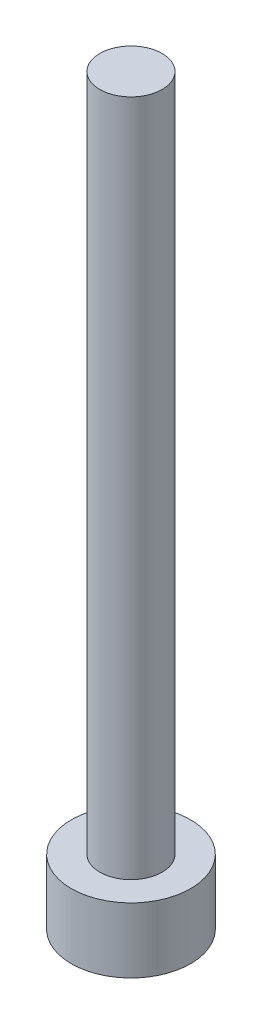
ISO-10303-21;
HEADER;
FILE_DESCRIPTION(('STEP AP214'),'2;1');
FILE_NAME('part.step','',(''),(''),'','','');
FILE_SCHEMA(('AUTOMOTIVE_DESIGN { 1 0 10303 214 1 1 1 1 }'));
ENDSEC;
DATA;
#1=APPLICATION_CONTEXT('core data for automotive mechanical design processes');
#2=APPLICATION_PROTOCOL_DEFINITION('international standard','automotive_design',2000,#1);
#3=PRODUCT_CONTEXT('',#1,'mechanical');
#4=PRODUCT('Part','Part','',(#3));
#5=PRODUCT_RELATED_PRODUCT_CATEGORY('part','',(#4));
#6=PRODUCT_DEFINITION_FORMATION('','',#4);
#7=PRODUCT_DEFINITION_CONTEXT('part definition',#1,'design');
#8=PRODUCT_DEFINITION('design','',#6,#7);
#9=PRODUCT_DEFINITION_SHAPE('','',#8);
#10=(LENGTH_UNIT() NAMED_UNIT(*) SI_UNIT(.MILLI.,.METRE.));
#11=(NAMED_UNIT(*) PLANE_ANGLE_UNIT() SI_UNIT($,.RADIAN.));
#12=(NAMED_UNIT(*) SI_UNIT($,.STERADIAN.) SOLID_ANGLE_UNIT());
#13=UNCERTAINTY_MEASURE_WITH_UNIT(LENGTH_MEASURE(1.E-05),#10,'distance_accuracy_value','');
#14=(GEOMETRIC_REPRESENTATION_CONTEXT(3) GLOBAL_UNCERTAINTY_ASSIGNED_CONTEXT((#13)) GLOBAL_UNIT_ASSIGNED_CONTEXT((#10,
#11,#12)) REPRESENTATION_CONTEXT('',''));
#15=CARTESIAN_POINT('',(0.,0.,0.));
#16=DIRECTION('',(0.,0.,1.));
#17=DIRECTION('',(1.,0.,0.));
#18=AXIS2_PLACEMENT_3D('',#15,#16,#17);
#19=CARTESIAN_POINT('',(0.,2.4,0.));
#20=DIRECTION('',(0.,-1.,0.));
#21=DIRECTION('',(0.,0.,-1.));
#22=AXIS2_PLACEMENT_3D('',#19,#20,#21);
#23=CYLINDRICAL_SURFACE('',#22,2.2);
#24=CARTESIAN_POINT('',(0.,2.4,0.));
#25=DIRECTION('',(0.,1.,0.));
#26=DIRECTION('',(0.,0.,1.));
#27=AXIS2_PLACEMENT_3D('',#24,#25,#26);
#28=CIRCLE('',#27,2.2);
#29=CARTESIAN_POINT('',(0.,2.4,2.2));
#30=VERTEX_POINT('',#29);
#31=EDGE_CURVE('E47',#30,#30,#28,.T.);
#32=ORIENTED_EDGE('',*,*,#31,.F.);
#33=EDGE_LOOP('',(#32));
#34=FACE_BOUND('',#33,.T.);
#35=CARTESIAN_POINT('',(0.,0.,0.));
#36=DIRECTION('',(0.,1.,0.));
#37=DIRECTION('',(0.,0.,1.));
#38=AXIS2_PLACEMENT_3D('',#35,#36,#37);
#39=CIRCLE('',#38,2.2);
#40=CARTESIAN_POINT('',(0.,0.,2.2));
#41=VERTEX_POINT('',#40);
#42=EDGE_CURVE('E42',#41,#41,#39,.T.);
#43=ORIENTED_EDGE('',*,*,#42,.T.);
#44=EDGE_LOOP('',(#43));
#45=FACE_BOUND('',#44,.T.);
#46=ADVANCED_FACE('F39',(#34,#45),#23,.T.);
#47=CARTESIAN_POINT('',(0.,2.4,0.));
#48=DIRECTION('',(0.,1.,0.));
#49=DIRECTION('',(0.,0.,1.));
#50=AXIS2_PLACEMENT_3D('',#47,#48,#49);
#51=PLANE('',#50);
#52=CARTESIAN_POINT('',(0.,2.4,0.));
#53=DIRECTION('',(0.,1.,0.));
#54=DIRECTION('',(0.,0.,1.));
#55=AXIS2_PLACEMENT_3D('',#52,#53,#54);
#56=CIRCLE('',#55,1.15);
#57=CARTESIAN_POINT('',(0.,2.4,1.15));
#58=VERTEX_POINT('',#57);
#59=EDGE_CURVE('E11',#58,#58,#56,.T.);
#60=ORIENTED_EDGE('',*,*,#59,.F.);
#61=EDGE_LOOP('',(#60));
#62=FACE_BOUND('',#61,.T.);
#63=ORIENTED_EDGE('',*,*,#31,.T.);
#64=EDGE_LOOP('',(#63));
#65=FACE_BOUND('',#64,.T.);
#66=ADVANCED_FACE('F216',(#62,#65),#51,.T.);
#67=CARTESIAN_POINT('',(0.,0.,0.));
#68=DIRECTION('',(0.,1.,0.));
#69=DIRECTION('',(0.,0.,1.));
#70=AXIS2_PLACEMENT_3D('',#67,#68,#69);
#71=PLANE('',#70);
#72=DIRECTION('',(1.,0.,0.));
#73=VECTOR('',#72,1.);
#74=CARTESIAN_POINT('',(0.,0.,0.999999999999996));
#75=LINE('',#74,#73);
#76=CARTESIAN_POINT('',(-0.567890834580024,0.,1.));
#77=VERTEX_POINT('',#76);
#78=CARTESIAN_POINT('',(0.567890834580045,0.,0.99999999999999));
#79=VERTEX_POINT('',#78);
#80=EDGE_CURVE('E55',#77,#79,#75,.T.);
#81=ORIENTED_EDGE('',*,*,#80,.T.);
#82=CARTESIAN_POINT('',(0.,0.,0.));
#83=DIRECTION('',(0.,1.,0.));
#84=DIRECTION('',(0.,0.,1.));
#85=AXIS2_PLACEMENT_3D('',#82,#83,#84);
#86=CIRCLE('',#85,1.15);
#87=CARTESIAN_POINT('',(0.58207998649443,0.,0.991807889322647));
#88=VERTEX_POINT('',#87);
#89=EDGE_CURVE('E164',#79,#88,#86,.T.);
#90=ORIENTED_EDGE('',*,*,#89,.T.);
#91=DIRECTION('',(0.499999999999995,0.,-0.866025403784442));
#92=VECTOR('',#91,1.);
#93=CARTESIAN_POINT('',(0.866025403784441,0.,0.499999999999995));
#94=LINE('',#93,#92);
#95=CARTESIAN_POINT('',(1.14997082107445,0.,0.0081921106773428));
#96=VERTEX_POINT('',#95);
#97=EDGE_CURVE('E167',#88,#96,#94,.T.);
#98=ORIENTED_EDGE('',*,*,#97,.T.);
#99=CARTESIAN_POINT('',(1.14997082107445,0.,-0.00819211067734334));
#100=VERTEX_POINT('',#99);
#101=EDGE_CURVE('E169',#96,#100,#86,.T.);
#102=ORIENTED_EDGE('',*,*,#101,.T.);
#103=DIRECTION('',(-0.500000000000001,0.,-0.866025403784438));
#104=VECTOR('',#103,1.);
#105=CARTESIAN_POINT('',(0.866025403784435,0.,-0.499999999999999));
#106=LINE('',#105,#104);
#107=CARTESIAN_POINT('',(0.582079986494417,0.,-0.991807889322655));
#108=VERTEX_POINT('',#107);
#109=EDGE_CURVE('E172',#100,#108,#106,.T.);
#110=ORIENTED_EDGE('',*,*,#109,.T.);
#111=CARTESIAN_POINT('',(0.567890834580031,0.,-0.999999999999998));
#112=VERTEX_POINT('',#111);
#113=EDGE_CURVE('E175',#108,#112,#86,.T.);
#114=ORIENTED_EDGE('',*,*,#113,.T.);
#115=DIRECTION('',(-1.,0.,0.));
#116=VECTOR('',#115,1.);
#117=CARTESIAN_POINT('',(0.,0.,-0.999999999999996));
#118=LINE('',#117,#116);
#119=CARTESIAN_POINT('',(-0.567890834580038,0.,-0.999999999999994));
#120=VERTEX_POINT('',#119);
#121=EDGE_CURVE('E176',#112,#120,#118,.T.);
#122=ORIENTED_EDGE('',*,*,#121,.T.);
#123=CARTESIAN_POINT('',(-0.582079986494424,0.,-0.991807889322651));
#124=VERTEX_POINT('',#123);
#125=EDGE_CURVE('E179',#120,#124,#86,.T.);
#126=ORIENTED_EDGE('',*,*,#125,.T.);
#127=DIRECTION('',(-0.499999999999995,0.,0.866025403784442));
#128=VECTOR('',#127,1.);
#129=CARTESIAN_POINT('',(-0.866025403784438,0.,-0.499999999999993));
#130=LINE('',#129,#128);
#131=CARTESIAN_POINT('',(-1.14997082107445,0.,-0.00819211067733553));
#132=VERTEX_POINT('',#131);
#133=EDGE_CURVE('E180',#124,#132,#130,.T.);
#134=ORIENTED_EDGE('',*,*,#133,.T.);
#135=CARTESIAN_POINT('',(-1.14997082107445,0.,0.00819211067735191));
#136=VERTEX_POINT('',#135);
#137=EDGE_CURVE('E183',#132,#136,#86,.T.);
#138=ORIENTED_EDGE('',*,*,#137,.T.);
#139=DIRECTION('',(0.500000000000007,0.,0.866025403784435));
#140=VECTOR('',#139,1.);
#141=CARTESIAN_POINT('',(-0.866025403784431,0.,0.500000000000005));
#142=LINE('',#141,#140);
#143=CARTESIAN_POINT('',(-0.582079986494411,0.,0.991807889322659));
#144=VERTEX_POINT('',#143);
#145=EDGE_CURVE('E154',#136,#144,#142,.T.);
#146=ORIENTED_EDGE('',*,*,#145,.T.);
#147=EDGE_CURVE('E168',#144,#77,#86,.T.);
#148=ORIENTED_EDGE('',*,*,#147,.T.);
#149=EDGE_LOOP('',(#81,#90,#98,#102,#110,#114,#122,#126,#134,#138,#146,#148));
#150=FACE_BOUND('',#149,.T.);
#151=ORIENTED_EDGE('',*,*,#42,.F.);
#152=EDGE_LOOP('',(#151));
#153=FACE_BOUND('',#152,.T.);
#154=ADVANCED_FACE('F213',(#150,#153),#71,.F.);
#155=CARTESIAN_POINT('',(0.,27.4,0.));
#156=DIRECTION('',(0.,-1.,0.));
#157=DIRECTION('',(0.,0.,-1.));
#158=AXIS2_PLACEMENT_3D('',#155,#156,#157);
#159=CYLINDRICAL_SURFACE('',#158,1.15);
#160=CARTESIAN_POINT('',(0.,27.4,0.));
#161=DIRECTION('',(0.,1.,0.));
#162=DIRECTION('',(0.,0.,1.));
#163=AXIS2_PLACEMENT_3D('',#160,#161,#162);
#164=CIRCLE('',#163,1.15);
#165=CARTESIAN_POINT('',(0.,27.4,1.15));
#166=VERTEX_POINT('',#165);
#167=EDGE_CURVE('E204',#166,#166,#164,.T.);
#168=ORIENTED_EDGE('',*,*,#167,.F.);
#169=EDGE_LOOP('',(#168));
#170=FACE_BOUND('',#169,.T.);
#171=ORIENTED_EDGE('',*,*,#59,.T.);
#172=EDGE_LOOP('',(#171));
#173=FACE_BOUND('',#172,.T.);
#174=ADVANCED_FACE('F215',(#170,#173),#159,.T.);
#175=CARTESIAN_POINT('',(0.,27.4,0.));
#176=DIRECTION('',(0.,1.,0.));
#177=DIRECTION('',(0.,0.,1.));
#178=AXIS2_PLACEMENT_3D('',#175,#176,#177);
#179=PLANE('',#178);
#180=ORIENTED_EDGE('',*,*,#167,.T.);
#181=EDGE_LOOP('',(#180));
#182=FACE_BOUND('',#181,.T.);
#183=ADVANCED_FACE('F222',(#182),#179,.T.);
#184=CARTESIAN_POINT('',(0.,1.5,0.999999999999996));
#185=DIRECTION('',(0.,0.,-1.));
#186=DIRECTION('',(-1.,0.,0.));
#187=AXIS2_PLACEMENT_3D('',#184,#185,#186);
#188=PLANE('',#187);
#189=ORIENTED_EDGE('',*,*,#80,.F.);
#190=DIRECTION('',(0.,-1.,0.));
#191=VECTOR('',#190,1.);
#192=CARTESIAN_POINT('',(-0.567890834580024,1.5,1.));
#193=LINE('',#192,#191);
#194=CARTESIAN_POINT('',(-0.567890834580024,1.5,1.));
#195=VERTEX_POINT('',#194);
#196=EDGE_CURVE('E159',#195,#77,#193,.T.);
#197=ORIENTED_EDGE('',*,*,#196,.F.);
#198=DIRECTION('',(1.,0.,0.));
#199=VECTOR('',#198,1.);
#200=CARTESIAN_POINT('',(0.,1.5,0.999999999999996));
#201=LINE('',#200,#199);
#202=CARTESIAN_POINT('',(0.567890834580045,1.5,0.99999999999999));
#203=VERTEX_POINT('',#202);
#204=EDGE_CURVE('E406',#195,#203,#201,.T.);
#205=ORIENTED_EDGE('',*,*,#204,.T.);
#206=DIRECTION('',(0.,-1.,0.));
#207=VECTOR('',#206,1.);
#208=CARTESIAN_POINT('',(0.567890834580045,1.5,0.99999999999999));
#209=LINE('',#208,#207);
#210=EDGE_CURVE('E202',#203,#79,#209,.T.);
#211=ORIENTED_EDGE('',*,*,#210,.T.);
#212=EDGE_LOOP('',(#189,#197,#205,#211));
#213=FACE_BOUND('',#212,.T.);
#214=ADVANCED_FACE('F251',(#213),#188,.T.);
#215=CARTESIAN_POINT('',(0.,1.5,0.));
#216=DIRECTION('',(0.,-1.,0.));
#217=DIRECTION('',(0.,0.,-1.));
#218=AXIS2_PLACEMENT_3D('',#215,#216,#217);
#219=CYLINDRICAL_SURFACE('',#218,1.15);
#220=ORIENTED_EDGE('',*,*,#89,.F.);
#221=ORIENTED_EDGE('',*,*,#210,.F.);
#222=CARTESIAN_POINT('',(0.,1.5,0.));
#223=DIRECTION('',(0.,1.,0.));
#224=DIRECTION('',(0.,0.,1.));
#225=AXIS2_PLACEMENT_3D('',#222,#223,#224);
#226=CIRCLE('',#225,1.15);
#227=CARTESIAN_POINT('',(0.58207998649443,1.5,0.991807889322647));
#228=VERTEX_POINT('',#227);
#229=EDGE_CURVE('E112',#203,#228,#226,.T.);
#230=ORIENTED_EDGE('',*,*,#229,.T.);
#231=DIRECTION('',(0.,-1.,0.));
#232=VECTOR('',#231,1.);
#233=CARTESIAN_POINT('',(0.58207998649443,1.5,0.991807889322647));
#234=LINE('',#233,#232);
#235=EDGE_CURVE('E200',#228,#88,#234,.T.);
#236=ORIENTED_EDGE('',*,*,#235,.T.);
#237=EDGE_LOOP('',(#220,#221,#230,#236));
#238=FACE_BOUND('',#237,.T.);
#239=ADVANCED_FACE('F266',(#238),#219,.F.);
#240=CARTESIAN_POINT('',(0.866025403784441,1.5,0.499999999999995));
#241=DIRECTION('',(-0.866025403784441,0.,-0.499999999999995));
#242=DIRECTION('',(-0.499999999999995,0.,0.866025403784442));
#243=AXIS2_PLACEMENT_3D('',#240,#241,#242);
#244=PLANE('',#243);
#245=ORIENTED_EDGE('',*,*,#97,.F.);
#246=ORIENTED_EDGE('',*,*,#235,.F.);
#247=DIRECTION('',(0.499999999999995,0.,-0.866025403784442));
#248=VECTOR('',#247,1.);
#249=CARTESIAN_POINT('',(0.866025403784441,1.5,0.499999999999995));
#250=LINE('',#249,#248);
#251=CARTESIAN_POINT('',(1.14997082107445,1.5,0.0081921106773428));
#252=VERTEX_POINT('',#251);
#253=EDGE_CURVE('E435',#228,#252,#250,.T.);
#254=ORIENTED_EDGE('',*,*,#253,.T.);
#255=DIRECTION('',(0.,-1.,0.));
#256=VECTOR('',#255,1.);
#257=CARTESIAN_POINT('',(1.14997082107445,1.5,0.0081921106773428));
#258=LINE('',#257,#256);
#259=EDGE_CURVE('E198',#252,#96,#258,.T.);
#260=ORIENTED_EDGE('',*,*,#259,.T.);
#261=EDGE_LOOP('',(#245,#246,#254,#260));
#262=FACE_BOUND('',#261,.T.);
#263=ADVANCED_FACE('F276',(#262),#244,.T.);
#264=ORIENTED_EDGE('',*,*,#101,.F.);
#265=ORIENTED_EDGE('',*,*,#259,.F.);
#266=CARTESIAN_POINT('',(1.14997082107445,1.5,-0.00819211067734334));
#267=VERTEX_POINT('',#266);
#268=EDGE_CURVE('E419',#252,#267,#226,.T.);
#269=ORIENTED_EDGE('',*,*,#268,.T.);
#270=DIRECTION('',(0.,-1.,0.));
#271=VECTOR('',#270,1.);
#272=CARTESIAN_POINT('',(1.14997082107445,1.5,-0.00819211067734334));
#273=LINE('',#272,#271);
#274=EDGE_CURVE('E196',#267,#100,#273,.T.);
#275=ORIENTED_EDGE('',*,*,#274,.T.);
#276=EDGE_LOOP('',(#264,#265,#269,#275));
#277=FACE_BOUND('',#276,.T.);
#278=ADVANCED_FACE('F279',(#277),#219,.F.);
#279=CARTESIAN_POINT('',(0.866025403784435,1.5,-0.499999999999999));
#280=DIRECTION('',(-0.866025403784438,0.,0.500000000000001));
#281=DIRECTION('',(0.500000000000001,0.,0.866025403784438));
#282=AXIS2_PLACEMENT_3D('',#279,#280,#281);
#283=PLANE('',#282);
#284=ORIENTED_EDGE('',*,*,#109,.F.);
#285=ORIENTED_EDGE('',*,*,#274,.F.);
#286=DIRECTION('',(-0.500000000000001,0.,-0.866025403784438));
#287=VECTOR('',#286,1.);
#288=CARTESIAN_POINT('',(0.866025403784435,1.5,-0.499999999999999));
#289=LINE('',#288,#287);
#290=CARTESIAN_POINT('',(0.582079986494417,1.5,-0.991807889322655));
#291=VERTEX_POINT('',#290);
#292=EDGE_CURVE('E422',#267,#291,#289,.T.);
#293=ORIENTED_EDGE('',*,*,#292,.T.);
#294=DIRECTION('',(0.,-1.,0.));
#295=VECTOR('',#294,1.);
#296=CARTESIAN_POINT('',(0.582079986494417,1.5,-0.991807889322655));
#297=LINE('',#296,#295);
#298=EDGE_CURVE('E194',#291,#108,#297,.T.);
#299=ORIENTED_EDGE('',*,*,#298,.T.);
#300=EDGE_LOOP('',(#284,#285,#293,#299));
#301=FACE_BOUND('',#300,.T.);
#302=ADVANCED_FACE('F299',(#301),#283,.T.);
#303=ORIENTED_EDGE('',*,*,#113,.F.);
#304=ORIENTED_EDGE('',*,*,#298,.F.);
#305=CARTESIAN_POINT('',(0.567890834580031,1.5,-0.999999999999998));
#306=VERTEX_POINT('',#305);
#307=EDGE_CURVE('E426',#291,#306,#226,.T.);
#308=ORIENTED_EDGE('',*,*,#307,.T.);
#309=DIRECTION('',(0.,-1.,0.));
#310=VECTOR('',#309,1.);
#311=CARTESIAN_POINT('',(0.567890834580031,1.5,-0.999999999999998));
#312=LINE('',#311,#310);
#313=EDGE_CURVE('E192',#306,#112,#312,.T.);
#314=ORIENTED_EDGE('',*,*,#313,.T.);
#315=EDGE_LOOP('',(#303,#304,#308,#314));
#316=FACE_BOUND('',#315,.T.);
#317=ADVANCED_FACE('F301',(#316),#219,.F.);
#318=CARTESIAN_POINT('',(0.,1.5,-0.999999999999996));
#319=DIRECTION('',(0.,0.,1.));
#320=DIRECTION('',(1.,0.,0.));
#321=AXIS2_PLACEMENT_3D('',#318,#319,#320);
#322=PLANE('',#321);
#323=ORIENTED_EDGE('',*,*,#121,.F.);
#324=ORIENTED_EDGE('',*,*,#313,.F.);
#325=DIRECTION('',(-1.,0.,0.));
#326=VECTOR('',#325,1.);
#327=CARTESIAN_POINT('',(0.,1.5,-0.999999999999996));
#328=LINE('',#327,#326);
#329=CARTESIAN_POINT('',(-0.567890834580038,1.5,-0.999999999999994));
#330=VERTEX_POINT('',#329);
#331=EDGE_CURVE('E429',#306,#330,#328,.T.);
#332=ORIENTED_EDGE('',*,*,#331,.T.);
#333=DIRECTION('',(0.,-1.,0.));
#334=VECTOR('',#333,1.);
#335=CARTESIAN_POINT('',(-0.567890834580038,1.5,-0.999999999999994));
#336=LINE('',#335,#334);
#337=EDGE_CURVE('E190',#330,#120,#336,.T.);
#338=ORIENTED_EDGE('',*,*,#337,.T.);
#339=EDGE_LOOP('',(#323,#324,#332,#338));
#340=FACE_BOUND('',#339,.T.);
#341=ADVANCED_FACE('F320',(#340),#322,.T.);
#342=ORIENTED_EDGE('',*,*,#125,.F.);
#343=ORIENTED_EDGE('',*,*,#337,.F.);
#344=CARTESIAN_POINT('',(-0.582079986494424,1.5,-0.991807889322651));
#345=VERTEX_POINT('',#344);
#346=EDGE_CURVE('E151',#330,#345,#226,.T.);
#347=ORIENTED_EDGE('',*,*,#346,.T.);
#348=DIRECTION('',(0.,-1.,0.));
#349=VECTOR('',#348,1.);
#350=CARTESIAN_POINT('',(-0.582079986494424,1.5,-0.991807889322651));
#351=LINE('',#350,#349);
#352=EDGE_CURVE('E188',#345,#124,#351,.T.);
#353=ORIENTED_EDGE('',*,*,#352,.T.);
#354=EDGE_LOOP('',(#342,#343,#347,#353));
#355=FACE_BOUND('',#354,.T.);
#356=ADVANCED_FACE('F322',(#355),#219,.F.);
#357=CARTESIAN_POINT('',(-0.866025403784438,1.5,-0.499999999999993));
#358=DIRECTION('',(0.866025403784441,0.,0.499999999999995));
#359=DIRECTION('',(0.499999999999995,0.,-0.866025403784442));
#360=AXIS2_PLACEMENT_3D('',#357,#358,#359);
#361=PLANE('',#360);
#362=ORIENTED_EDGE('',*,*,#133,.F.);
#363=ORIENTED_EDGE('',*,*,#352,.F.);
#364=DIRECTION('',(-0.499999999999995,0.,0.866025403784442));
#365=VECTOR('',#364,1.);
#366=CARTESIAN_POINT('',(-0.866025403784438,1.5,-0.499999999999993));
#367=LINE('',#366,#365);
#368=CARTESIAN_POINT('',(-1.14997082107445,1.5,-0.00819211067733553));
#369=VERTEX_POINT('',#368);
#370=EDGE_CURVE('E149',#345,#369,#367,.T.);
#371=ORIENTED_EDGE('',*,*,#370,.T.);
#372=DIRECTION('',(0.,-1.,0.));
#373=VECTOR('',#372,1.);
#374=CARTESIAN_POINT('',(-1.14997082107445,1.5,-0.00819211067733553));
#375=LINE('',#374,#373);
#376=EDGE_CURVE('E145',#369,#132,#375,.T.);
#377=ORIENTED_EDGE('',*,*,#376,.T.);
#378=EDGE_LOOP('',(#362,#363,#371,#377));
#379=FACE_BOUND('',#378,.T.);
#380=ADVANCED_FACE('F341',(#379),#361,.T.);
#381=ORIENTED_EDGE('',*,*,#137,.F.);
#382=ORIENTED_EDGE('',*,*,#376,.F.);
#383=CARTESIAN_POINT('',(-1.14997082107445,1.5,0.00819211067735191));
#384=VERTEX_POINT('',#383);
#385=EDGE_CURVE('E140',#369,#384,#226,.T.);
#386=ORIENTED_EDGE('',*,*,#385,.T.);
#387=DIRECTION('',(0.,-1.,0.));
#388=VECTOR('',#387,1.);
#389=CARTESIAN_POINT('',(-1.14997082107445,1.5,0.00819211067735191));
#390=LINE('',#389,#388);
#391=EDGE_CURVE('E144',#384,#136,#390,.T.);
#392=ORIENTED_EDGE('',*,*,#391,.T.);
#393=EDGE_LOOP('',(#381,#382,#386,#392));
#394=FACE_BOUND('',#393,.T.);
#395=ADVANCED_FACE('F143',(#394),#219,.F.);
#396=CARTESIAN_POINT('',(-0.866025403784431,1.5,0.500000000000005));
#397=DIRECTION('',(0.866025403784434,0.,-0.500000000000007));
#398=DIRECTION('',(-0.500000000000007,0.,-0.866025403784435));
#399=AXIS2_PLACEMENT_3D('',#396,#397,#398);
#400=PLANE('',#399);
#401=ORIENTED_EDGE('',*,*,#145,.F.);
#402=ORIENTED_EDGE('',*,*,#391,.F.);
#403=DIRECTION('',(0.500000000000007,0.,0.866025403784435));
#404=VECTOR('',#403,1.);
#405=CARTESIAN_POINT('',(-0.866025403784431,1.5,0.500000000000005));
#406=LINE('',#405,#404);
#407=CARTESIAN_POINT('',(-0.582079986494411,1.5,0.991807889322659));
#408=VERTEX_POINT('',#407);
#409=EDGE_CURVE('E148',#384,#408,#406,.T.);
#410=ORIENTED_EDGE('',*,*,#409,.T.);
#411=DIRECTION('',(0.,-1.,0.));
#412=VECTOR('',#411,1.);
#413=CARTESIAN_POINT('',(-0.582079986494411,1.5,0.991807889322659));
#414=LINE('',#413,#412);
#415=EDGE_CURVE('E103',#408,#144,#414,.T.);
#416=ORIENTED_EDGE('',*,*,#415,.T.);
#417=EDGE_LOOP('',(#401,#402,#410,#416));
#418=FACE_BOUND('',#417,.T.);
#419=ADVANCED_FACE('F152',(#418),#400,.T.);
#420=ORIENTED_EDGE('',*,*,#147,.F.);
#421=ORIENTED_EDGE('',*,*,#415,.F.);
#422=EDGE_CURVE('E63',#408,#195,#226,.T.);
#423=ORIENTED_EDGE('',*,*,#422,.T.);
#424=ORIENTED_EDGE('',*,*,#196,.T.);
#425=EDGE_LOOP('',(#420,#421,#423,#424));
#426=FACE_BOUND('',#425,.T.);
#427=ADVANCED_FACE('F280',(#426),#219,.F.);
#428=CARTESIAN_POINT('',(0.,1.5,0.));
#429=DIRECTION('',(0.,1.,0.));
#430=DIRECTION('',(0.,0.,1.));
#431=AXIS2_PLACEMENT_3D('',#428,#429,#430);
#432=PLANE('',#431);
#433=ORIENTED_EDGE('',*,*,#204,.F.);
#434=ORIENTED_EDGE('',*,*,#422,.F.);
#435=ORIENTED_EDGE('',*,*,#409,.F.);
#436=ORIENTED_EDGE('',*,*,#385,.F.);
#437=ORIENTED_EDGE('',*,*,#370,.F.);
#438=ORIENTED_EDGE('',*,*,#346,.F.);
#439=ORIENTED_EDGE('',*,*,#331,.F.);
#440=ORIENTED_EDGE('',*,*,#307,.F.);
#441=ORIENTED_EDGE('',*,*,#292,.F.);
#442=ORIENTED_EDGE('',*,*,#268,.F.);
#443=ORIENTED_EDGE('',*,*,#253,.F.);
#444=ORIENTED_EDGE('',*,*,#229,.F.);
#445=EDGE_LOOP('',(#433,#434,#435,#436,#437,#438,#439,#440,#441,#442,#443,#444));
#446=FACE_BOUND('',#445,.T.);
#447=ADVANCED_FACE('F157',(#446),#432,.F.);
#448=CLOSED_SHELL('',(#46,#66,#154,#174,#183,#214,#239,#263,#278,#302,#317,#341,#356,#380,#395,
#419,#427,#447));
#449=MANIFOLD_SOLID_BREP('B2',#448);
#450=ADVANCED_BREP_SHAPE_REPRESENTATION('',(#18,#449),#14);
#451=SHAPE_DEFINITION_REPRESENTATION(#9,#450);
ENDSEC;
END-ISO-10303-21;
